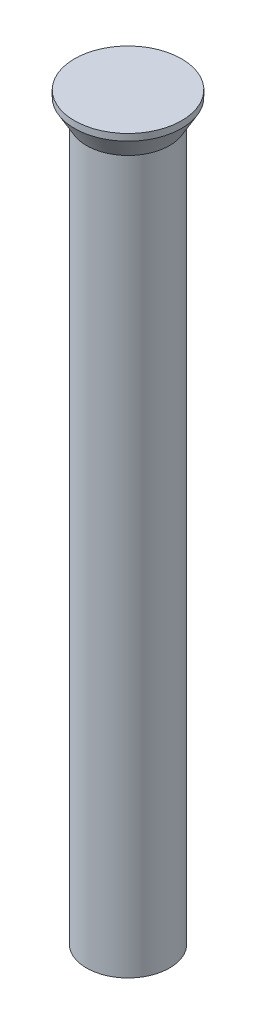
ISO-10303-21;
HEADER;
FILE_DESCRIPTION(('STEP AP214'),'2;1');
FILE_NAME('part.step','',(''),(''),'','','');
FILE_SCHEMA(('AUTOMOTIVE_DESIGN { 1 0 10303 214 1 1 1 1 }'));
ENDSEC;
DATA;
#1=APPLICATION_CONTEXT('core data for automotive mechanical design processes');
#2=APPLICATION_PROTOCOL_DEFINITION('international standard','automotive_design',2000,#1);
#3=PRODUCT_CONTEXT('',#1,'mechanical');
#4=PRODUCT('Part','Part','',(#3));
#5=PRODUCT_RELATED_PRODUCT_CATEGORY('part','',(#4));
#6=PRODUCT_DEFINITION_FORMATION('','',#4);
#7=PRODUCT_DEFINITION_CONTEXT('part definition',#1,'design');
#8=PRODUCT_DEFINITION('design','',#6,#7);
#9=PRODUCT_DEFINITION_SHAPE('','',#8);
#10=(LENGTH_UNIT() NAMED_UNIT(*) SI_UNIT(.MILLI.,.METRE.));
#11=(NAMED_UNIT(*) PLANE_ANGLE_UNIT() SI_UNIT($,.RADIAN.));
#12=(NAMED_UNIT(*) SI_UNIT($,.STERADIAN.) SOLID_ANGLE_UNIT());
#13=UNCERTAINTY_MEASURE_WITH_UNIT(LENGTH_MEASURE(1.E-05),#10,'distance_accuracy_value','');
#14=(GEOMETRIC_REPRESENTATION_CONTEXT(3) GLOBAL_UNCERTAINTY_ASSIGNED_CONTEXT((#13)) GLOBAL_UNIT_ASSIGNED_CONTEXT((#10,
#11,#12)) REPRESENTATION_CONTEXT('',''));
#15=CARTESIAN_POINT('',(0.,0.,0.));
#16=DIRECTION('',(0.,0.,1.));
#17=DIRECTION('',(1.,0.,0.));
#18=AXIS2_PLACEMENT_3D('',#15,#16,#17);
#19=CARTESIAN_POINT('',(0.,0.,0.));
#20=DIRECTION('',(0.,1.,0.));
#21=DIRECTION('',(0.,0.,1.));
#22=AXIS2_PLACEMENT_3D('',#19,#20,#21);
#23=PLANE('',#22);
#24=CARTESIAN_POINT('',(0.,0.,0.));
#25=DIRECTION('',(0.,-1.,0.));
#26=DIRECTION('',(0.,0.,-1.));
#27=AXIS2_PLACEMENT_3D('',#24,#25,#26);
#28=CIRCLE('',#27,4.);
#29=CARTESIAN_POINT('',(0.,0.,-4.));
#30=VERTEX_POINT('',#29);
#31=EDGE_CURVE('E10',#30,#30,#28,.T.);
#32=ORIENTED_EDGE('',*,*,#31,.F.);
#33=EDGE_LOOP('',(#32));
#34=FACE_BOUND('',#33,.T.);
#35=ADVANCED_FACE('F37',(#34),#23,.T.);
#36=CARTESIAN_POINT('',(0.,-60.2,0.));
#37=DIRECTION('',(0.,-1.,0.));
#38=DIRECTION('',(0.,0.,-1.));
#39=AXIS2_PLACEMENT_3D('',#36,#37,#38);
#40=CYLINDRICAL_SURFACE('',#39,4.);
#41=ORIENTED_EDGE('',*,*,#31,.T.);
#42=EDGE_LOOP('',(#41));
#43=FACE_BOUND('',#42,.T.);
#44=CARTESIAN_POINT('',(0.,-0.5,0.));
#45=DIRECTION('',(0.,-1.,0.));
#46=DIRECTION('',(0.,0.,-1.));
#47=AXIS2_PLACEMENT_3D('',#44,#45,#46);
#48=CIRCLE('',#47,4.);
#49=CARTESIAN_POINT('',(0.,-0.5,-4.));
#50=VERTEX_POINT('',#49);
#51=EDGE_CURVE('E43',#50,#50,#48,.T.);
#52=ORIENTED_EDGE('',*,*,#51,.F.);
#53=EDGE_LOOP('',(#52));
#54=FACE_BOUND('',#53,.T.);
#55=ADVANCED_FACE('F69',(#43,#54),#40,.T.);
#56=CARTESIAN_POINT('',(0.,-2.05884572681201,0.));
#57=DIRECTION('',(0.,1.,0.));
#58=DIRECTION('',(0.,0.,1.));
#59=AXIS2_PLACEMENT_3D('',#56,#57,#58);
#60=CONICAL_SURFACE('',#59,3.1,0.523598775598293);
#61=ORIENTED_EDGE('',*,*,#51,.T.);
#62=EDGE_LOOP('',(#61));
#63=FACE_BOUND('',#62,.T.);
#64=CARTESIAN_POINT('',(0.,-2.05884572681201,0.));
#65=DIRECTION('',(0.,-1.,0.));
#66=DIRECTION('',(0.,0.,-1.));
#67=AXIS2_PLACEMENT_3D('',#64,#65,#66);
#68=CIRCLE('',#67,3.1);
#69=CARTESIAN_POINT('',(0.,-2.05884572681201,-3.1));
#70=VERTEX_POINT('',#69);
#71=EDGE_CURVE('E47',#70,#70,#68,.T.);
#72=ORIENTED_EDGE('',*,*,#71,.F.);
#73=EDGE_LOOP('',(#72));
#74=FACE_BOUND('',#73,.T.);
#75=ADVANCED_FACE('F61',(#63,#74),#60,.T.);
#76=CARTESIAN_POINT('',(0.,-60.2,0.));
#77=DIRECTION('',(0.,-1.,0.));
#78=DIRECTION('',(0.,0.,-1.));
#79=AXIS2_PLACEMENT_3D('',#76,#77,#78);
#80=CYLINDRICAL_SURFACE('',#79,3.1);
#81=ORIENTED_EDGE('',*,*,#71,.T.);
#82=EDGE_LOOP('',(#81));
#83=FACE_BOUND('',#82,.T.);
#84=CARTESIAN_POINT('',(0.,-55.2,0.));
#85=DIRECTION('',(0.,-1.,0.));
#86=DIRECTION('',(0.,0.,-1.));
#87=AXIS2_PLACEMENT_3D('',#84,#85,#86);
#88=CIRCLE('',#87,3.10000000000001);
#89=CARTESIAN_POINT('',(0.,-55.2,-3.10000000000001));
#90=VERTEX_POINT('',#89);
#91=EDGE_CURVE('E51',#90,#90,#88,.T.);
#92=ORIENTED_EDGE('',*,*,#91,.F.);
#93=EDGE_LOOP('',(#92));
#94=FACE_BOUND('',#93,.T.);
#95=ADVANCED_FACE('F59',(#83,#94),#80,.T.);
#96=CARTESIAN_POINT('',(3.10000000000001,-55.2,0.));
#97=DIRECTION('',(0.,-1.,0.));
#98=DIRECTION('',(0.,0.,-1.));
#99=AXIS2_PLACEMENT_3D('',#96,#97,#98);
#100=PLANE('',#99);
#101=ORIENTED_EDGE('',*,*,#91,.T.);
#102=EDGE_LOOP('',(#101));
#103=FACE_BOUND('',#102,.T.);
#104=ADVANCED_FACE('F57',(#103),#100,.T.);
#105=CLOSED_SHELL('',(#35,#55,#75,#95,#104));
#106=MANIFOLD_SOLID_BREP('B2',#105);
#107=ADVANCED_BREP_SHAPE_REPRESENTATION('',(#18,#106),#14);
#108=SHAPE_DEFINITION_REPRESENTATION(#9,#107);
ENDSEC;
END-ISO-10303-21;
